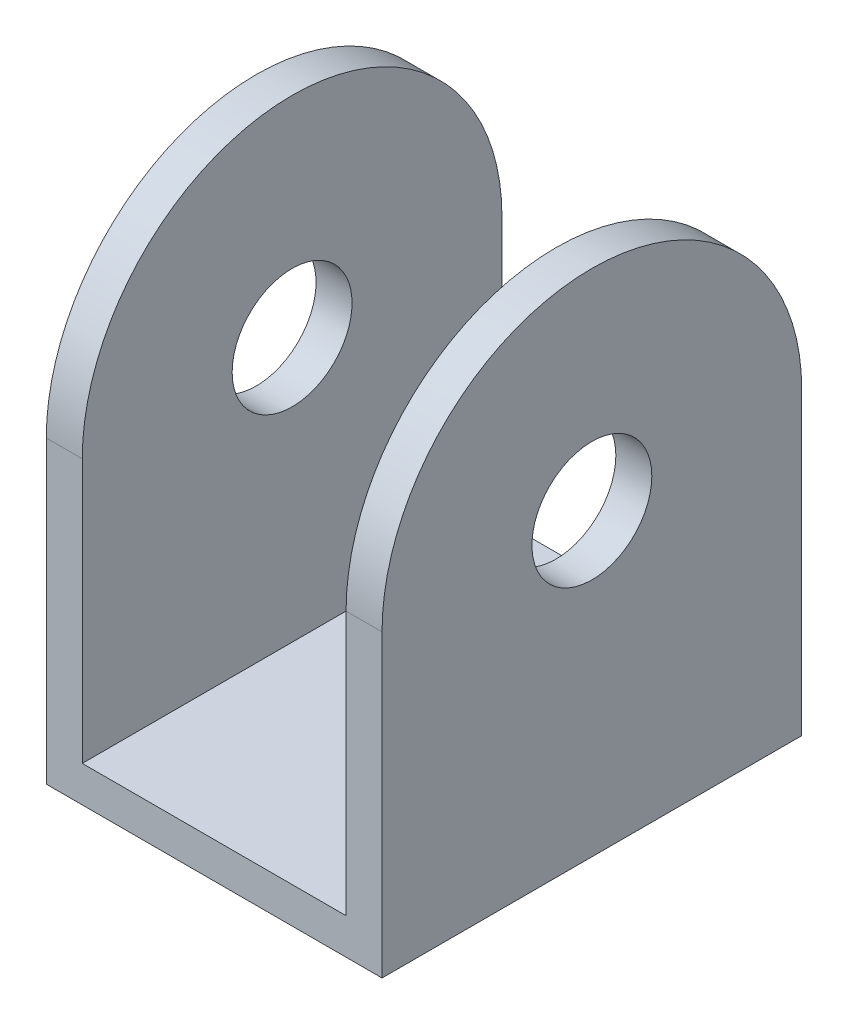
ISO-10303-21;
HEADER;
FILE_DESCRIPTION(('STEP AP214'),'2;1');
FILE_NAME('part.step','',(''),(''),'','','');
FILE_SCHEMA(('AUTOMOTIVE_DESIGN { 1 0 10303 214 1 1 1 1 }'));
ENDSEC;
DATA;
#1=APPLICATION_CONTEXT('core data for automotive mechanical design processes');
#2=APPLICATION_PROTOCOL_DEFINITION('international standard','automotive_design',2000,#1);
#3=PRODUCT_CONTEXT('',#1,'mechanical');
#4=PRODUCT('Part','Part','',(#3));
#5=PRODUCT_RELATED_PRODUCT_CATEGORY('part','',(#4));
#6=PRODUCT_DEFINITION_FORMATION('','',#4);
#7=PRODUCT_DEFINITION_CONTEXT('part definition',#1,'design');
#8=PRODUCT_DEFINITION('design','',#6,#7);
#9=PRODUCT_DEFINITION_SHAPE('','',#8);
#10=(LENGTH_UNIT() NAMED_UNIT(*) SI_UNIT(.MILLI.,.METRE.));
#11=(NAMED_UNIT(*) PLANE_ANGLE_UNIT() SI_UNIT($,.RADIAN.));
#12=(NAMED_UNIT(*) SI_UNIT($,.STERADIAN.) SOLID_ANGLE_UNIT());
#13=UNCERTAINTY_MEASURE_WITH_UNIT(LENGTH_MEASURE(1.E-05),#10,'distance_accuracy_value','');
#14=(GEOMETRIC_REPRESENTATION_CONTEXT(3) GLOBAL_UNCERTAINTY_ASSIGNED_CONTEXT((#13)) GLOBAL_UNIT_ASSIGNED_CONTEXT((#10,
#11,#12)) REPRESENTATION_CONTEXT('',''));
#15=CARTESIAN_POINT('',(0.,0.,0.));
#16=DIRECTION('',(0.,0.,1.));
#17=DIRECTION('',(1.,0.,0.));
#18=AXIS2_PLACEMENT_3D('',#15,#16,#17);
#19=CARTESIAN_POINT('',(-56.1860465116279,3.,17.5813953488372));
#20=DIRECTION('',(0.,0.,-1.));
#21=DIRECTION('',(-1.,0.,0.));
#22=AXIS2_PLACEMENT_3D('',#19,#20,#21);
#23=PLANE('',#22);
#24=DIRECTION('',(1.,0.,0.));
#25=VECTOR('',#24,1.);
#26=CARTESIAN_POINT('',(-56.1860465116279,0.,17.5813953488372));
#27=LINE('',#26,#25);
#28=CARTESIAN_POINT('',(-59.186046511628,0.,17.5813953488372));
#29=VERTEX_POINT('',#28);
#30=CARTESIAN_POINT('',(-31.1860465116279,0.,17.5813953488372));
#31=VERTEX_POINT('',#30);
#32=EDGE_CURVE('E178',#29,#31,#27,.T.);
#33=ORIENTED_EDGE('',*,*,#32,.T.);
#34=DIRECTION('',(0.,1.,0.));
#35=VECTOR('',#34,1.);
#36=CARTESIAN_POINT('',(-31.1860465116279,0.,17.5813953488372));
#37=LINE('',#36,#35);
#38=CARTESIAN_POINT('',(-31.1860465116279,25.,17.5813953488372));
#39=VERTEX_POINT('',#38);
#40=EDGE_CURVE('E153',#31,#39,#37,.T.);
#41=ORIENTED_EDGE('',*,*,#40,.T.);
#42=DIRECTION('',(-1.,0.,0.));
#43=VECTOR('',#42,1.);
#44=CARTESIAN_POINT('',(-31.1860465116279,25.,17.5813953488372));
#45=LINE('',#44,#43);
#46=CARTESIAN_POINT('',(-34.1860465116279,25.,17.5813953488372));
#47=VERTEX_POINT('',#46);
#48=EDGE_CURVE('E175',#39,#47,#45,.T.);
#49=ORIENTED_EDGE('',*,*,#48,.T.);
#50=DIRECTION('',(0.,1.,0.));
#51=VECTOR('',#50,1.);
#52=CARTESIAN_POINT('',(-34.1860465116279,0.,17.5813953488372));
#53=LINE('',#52,#51);
#54=CARTESIAN_POINT('',(-34.1860465116279,3.,17.5813953488372));
#55=VERTEX_POINT('',#54);
#56=EDGE_CURVE('E168',#55,#47,#53,.T.);
#57=ORIENTED_EDGE('',*,*,#56,.F.);
#58=DIRECTION('',(1.,0.,0.));
#59=VECTOR('',#58,1.);
#60=CARTESIAN_POINT('',(-56.1860465116279,3.,17.5813953488372));
#61=LINE('',#60,#59);
#62=CARTESIAN_POINT('',(-56.1860465116279,3.,17.5813953488372));
#63=VERTEX_POINT('',#62);
#64=EDGE_CURVE('E182',#63,#55,#61,.T.);
#65=ORIENTED_EDGE('',*,*,#64,.F.);
#66=DIRECTION('',(0.,1.,0.));
#67=VECTOR('',#66,1.);
#68=CARTESIAN_POINT('',(-56.186046511628,0.,17.5813953488372));
#69=LINE('',#68,#67);
#70=CARTESIAN_POINT('',(-56.186046511628,25.,17.5813953488372));
#71=VERTEX_POINT('',#70);
#72=EDGE_CURVE('E67',#63,#71,#69,.T.);
#73=ORIENTED_EDGE('',*,*,#72,.T.);
#74=DIRECTION('',(1.,0.,0.));
#75=VECTOR('',#74,1.);
#76=CARTESIAN_POINT('',(-59.186046511628,25.,17.5813953488372));
#77=LINE('',#76,#75);
#78=CARTESIAN_POINT('',(-59.186046511628,25.,17.5813953488372));
#79=VERTEX_POINT('',#78);
#80=EDGE_CURVE('E131',#79,#71,#77,.T.);
#81=ORIENTED_EDGE('',*,*,#80,.F.);
#82=DIRECTION('',(0.,1.,0.));
#83=VECTOR('',#82,1.);
#84=CARTESIAN_POINT('',(-59.186046511628,0.,17.5813953488372));
#85=LINE('',#84,#83);
#86=EDGE_CURVE('E117',#29,#79,#85,.T.);
#87=ORIENTED_EDGE('',*,*,#86,.F.);
#88=EDGE_LOOP('',(#33,#41,#49,#57,#65,#73,#81,#87));
#89=FACE_BOUND('',#88,.T.);
#90=ADVANCED_FACE('F43',(#89),#23,.F.);
#91=CARTESIAN_POINT('',(-56.186046511628,3.,-17.4186046511628));
#92=DIRECTION('',(0.,0.,1.));
#93=DIRECTION('',(1.,0.,0.));
#94=AXIS2_PLACEMENT_3D('',#91,#92,#93);
#95=PLANE('',#94);
#96=DIRECTION('',(-1.,0.,0.));
#97=VECTOR('',#96,1.);
#98=CARTESIAN_POINT('',(-56.186046511628,0.,-17.4186046511628));
#99=LINE('',#98,#97);
#100=CARTESIAN_POINT('',(-31.186046511628,0.,-17.4186046511628));
#101=VERTEX_POINT('',#100);
#102=CARTESIAN_POINT('',(-59.186046511628,0.,-17.4186046511628));
#103=VERTEX_POINT('',#102);
#104=EDGE_CURVE('E46',#101,#103,#99,.T.);
#105=ORIENTED_EDGE('',*,*,#104,.T.);
#106=DIRECTION('',(0.,1.,0.));
#107=VECTOR('',#106,1.);
#108=CARTESIAN_POINT('',(-59.186046511628,0.,-17.4186046511628));
#109=LINE('',#108,#107);
#110=CARTESIAN_POINT('',(-59.186046511628,25.,-17.4186046511628));
#111=VERTEX_POINT('',#110);
#112=EDGE_CURVE('E115',#103,#111,#109,.T.);
#113=ORIENTED_EDGE('',*,*,#112,.T.);
#114=DIRECTION('',(1.,0.,0.));
#115=VECTOR('',#114,1.);
#116=CARTESIAN_POINT('',(-59.186046511628,25.,-17.4186046511628));
#117=LINE('',#116,#115);
#118=CARTESIAN_POINT('',(-56.186046511628,25.,-17.4186046511628));
#119=VERTEX_POINT('',#118);
#120=EDGE_CURVE('E125',#111,#119,#117,.T.);
#121=ORIENTED_EDGE('',*,*,#120,.T.);
#122=DIRECTION('',(0.,1.,0.));
#123=VECTOR('',#122,1.);
#124=CARTESIAN_POINT('',(-56.186046511628,0.,-17.4186046511628));
#125=LINE('',#124,#123);
#126=CARTESIAN_POINT('',(-56.186046511628,3.,-17.4186046511628));
#127=VERTEX_POINT('',#126);
#128=EDGE_CURVE('E145',#127,#119,#125,.T.);
#129=ORIENTED_EDGE('',*,*,#128,.F.);
#130=DIRECTION('',(-1.,0.,0.));
#131=VECTOR('',#130,1.);
#132=CARTESIAN_POINT('',(-56.186046511628,3.,-17.4186046511628));
#133=LINE('',#132,#131);
#134=CARTESIAN_POINT('',(-34.186046511628,3.,-17.4186046511628));
#135=VERTEX_POINT('',#134);
#136=EDGE_CURVE('E11',#135,#127,#133,.T.);
#137=ORIENTED_EDGE('',*,*,#136,.F.);
#138=DIRECTION('',(0.,1.,0.));
#139=VECTOR('',#138,1.);
#140=CARTESIAN_POINT('',(-34.186046511628,0.,-17.4186046511628));
#141=LINE('',#140,#139);
#142=CARTESIAN_POINT('',(-34.186046511628,25.,-17.4186046511628));
#143=VERTEX_POINT('',#142);
#144=EDGE_CURVE('E59',#135,#143,#141,.T.);
#145=ORIENTED_EDGE('',*,*,#144,.T.);
#146=DIRECTION('',(-1.,0.,0.));
#147=VECTOR('',#146,1.);
#148=CARTESIAN_POINT('',(-31.186046511628,25.,-17.4186046511628));
#149=LINE('',#148,#147);
#150=CARTESIAN_POINT('',(-31.186046511628,25.,-17.4186046511628));
#151=VERTEX_POINT('',#150);
#152=EDGE_CURVE('E165',#151,#143,#149,.T.);
#153=ORIENTED_EDGE('',*,*,#152,.F.);
#154=DIRECTION('',(0.,1.,0.));
#155=VECTOR('',#154,1.);
#156=CARTESIAN_POINT('',(-31.186046511628,0.,-17.4186046511628));
#157=LINE('',#156,#155);
#158=EDGE_CURVE('E160',#101,#151,#157,.T.);
#159=ORIENTED_EDGE('',*,*,#158,.F.);
#160=EDGE_LOOP('',(#105,#113,#121,#129,#137,#145,#153,#159));
#161=FACE_BOUND('',#160,.T.);
#162=ADVANCED_FACE('F133',(#161),#95,.F.);
#163=CARTESIAN_POINT('',(0.,3.,0.));
#164=DIRECTION('',(0.,1.,0.));
#165=DIRECTION('',(0.,0.,1.));
#166=AXIS2_PLACEMENT_3D('',#163,#164,#165);
#167=PLANE('',#166);
#168=DIRECTION('',(0.,0.,1.));
#169=VECTOR('',#168,1.);
#170=CARTESIAN_POINT('',(-56.186046511628,3.,-17.4186046511628));
#171=LINE('',#170,#169);
#172=EDGE_CURVE('E179',#127,#63,#171,.T.);
#173=ORIENTED_EDGE('',*,*,#172,.T.);
#174=ORIENTED_EDGE('',*,*,#64,.T.);
#175=DIRECTION('',(0.,0.,-1.));
#176=VECTOR('',#175,1.);
#177=CARTESIAN_POINT('',(-34.186046511628,3.,-17.4186046511628));
#178=LINE('',#177,#176);
#179=EDGE_CURVE('E51',#55,#135,#178,.T.);
#180=ORIENTED_EDGE('',*,*,#179,.T.);
#181=ORIENTED_EDGE('',*,*,#136,.T.);
#182=EDGE_LOOP('',(#173,#174,#180,#181));
#183=FACE_BOUND('',#182,.T.);
#184=ADVANCED_FACE('F200',(#183),#167,.T.);
#185=CARTESIAN_POINT('',(0.,0.,0.));
#186=DIRECTION('',(0.,1.,0.));
#187=DIRECTION('',(0.,0.,1.));
#188=AXIS2_PLACEMENT_3D('',#185,#186,#187);
#189=PLANE('',#188);
#190=ORIENTED_EDGE('',*,*,#32,.F.);
#191=DIRECTION('',(0.,0.,1.));
#192=VECTOR('',#191,1.);
#193=CARTESIAN_POINT('',(-59.186046511628,0.,0.));
#194=LINE('',#193,#192);
#195=EDGE_CURVE('E136',#103,#29,#194,.T.);
#196=ORIENTED_EDGE('',*,*,#195,.F.);
#197=ORIENTED_EDGE('',*,*,#104,.F.);
#198=DIRECTION('',(0.,0.,-1.));
#199=VECTOR('',#198,1.);
#200=CARTESIAN_POINT('',(-31.186046511628,0.,0.));
#201=LINE('',#200,#199);
#202=EDGE_CURVE('E157',#31,#101,#201,.T.);
#203=ORIENTED_EDGE('',*,*,#202,.F.);
#204=EDGE_LOOP('',(#190,#196,#197,#203));
#205=FACE_BOUND('',#204,.T.);
#206=ADVANCED_FACE('F189',(#205),#189,.F.);
#207=CARTESIAN_POINT('',(-31.186046511628,25.,0.0813953488372125));
#208=DIRECTION('',(-1.,0.,0.));
#209=DIRECTION('',(0.,0.,1.));
#210=AXIS2_PLACEMENT_3D('',#207,#208,#209);
#211=CYLINDRICAL_SURFACE('',#210,17.5);
#212=CARTESIAN_POINT('',(-34.1860465116279,25.,0.0813953488372137));
#213=DIRECTION('',(1.,0.,0.));
#214=DIRECTION('',(0.,0.,-1.));
#215=AXIS2_PLACEMENT_3D('',#212,#213,#214);
#216=CIRCLE('',#215,17.5);
#217=EDGE_CURVE('E130',#143,#47,#216,.T.);
#218=ORIENTED_EDGE('',*,*,#217,.T.);
#219=ORIENTED_EDGE('',*,*,#48,.F.);
#220=CARTESIAN_POINT('',(-31.186046511628,25.,0.0813953488372125));
#221=DIRECTION('',(1.,0.,0.));
#222=DIRECTION('',(0.,0.,-1.));
#223=AXIS2_PLACEMENT_3D('',#220,#221,#222);
#224=CIRCLE('',#223,17.5);
#225=EDGE_CURVE('E151',#151,#39,#224,.T.);
#226=ORIENTED_EDGE('',*,*,#225,.F.);
#227=ORIENTED_EDGE('',*,*,#152,.T.);
#228=EDGE_LOOP('',(#218,#219,#226,#227));
#229=FACE_BOUND('',#228,.T.);
#230=ADVANCED_FACE('F197',(#229),#211,.T.);
#231=CARTESIAN_POINT('',(-31.186046511628,25.,0.0813953488372125));
#232=DIRECTION('',(-1.,0.,0.));
#233=DIRECTION('',(0.,0.,1.));
#234=AXIS2_PLACEMENT_3D('',#231,#232,#233);
#235=CYLINDRICAL_SURFACE('',#234,5.);
#236=CARTESIAN_POINT('',(-31.186046511628,25.,0.0813953488372125));
#237=DIRECTION('',(1.,0.,0.));
#238=DIRECTION('',(0.,0.,-1.));
#239=AXIS2_PLACEMENT_3D('',#236,#237,#238);
#240=CIRCLE('',#239,5.);
#241=CARTESIAN_POINT('',(-31.186046511628,25.,-4.91860465116279));
#242=VERTEX_POINT('',#241);
#243=EDGE_CURVE('E162',#242,#242,#240,.T.);
#244=ORIENTED_EDGE('',*,*,#243,.T.);
#245=EDGE_LOOP('',(#244));
#246=FACE_BOUND('',#245,.T.);
#247=CARTESIAN_POINT('',(-34.1860465116279,25.,0.0813953488372137));
#248=DIRECTION('',(1.,0.,0.));
#249=DIRECTION('',(0.,0.,-1.));
#250=AXIS2_PLACEMENT_3D('',#247,#248,#249);
#251=CIRCLE('',#250,5.);
#252=CARTESIAN_POINT('',(-34.1860465116279,25.,-4.91860465116279));
#253=VERTEX_POINT('',#252);
#254=EDGE_CURVE('E154',#253,#253,#251,.T.);
#255=ORIENTED_EDGE('',*,*,#254,.F.);
#256=EDGE_LOOP('',(#255));
#257=FACE_BOUND('',#256,.T.);
#258=ADVANCED_FACE('F210',(#246,#257),#235,.F.);
#259=CARTESIAN_POINT('',(-31.186046511628,0.,0.));
#260=DIRECTION('',(1.,0.,0.));
#261=DIRECTION('',(0.,0.,-1.));
#262=AXIS2_PLACEMENT_3D('',#259,#260,#261);
#263=PLANE('',#262);
#264=ORIENTED_EDGE('',*,*,#225,.T.);
#265=ORIENTED_EDGE('',*,*,#40,.F.);
#266=ORIENTED_EDGE('',*,*,#202,.T.);
#267=ORIENTED_EDGE('',*,*,#158,.T.);
#268=EDGE_LOOP('',(#264,#265,#266,#267));
#269=FACE_BOUND('',#268,.T.);
#270=ORIENTED_EDGE('',*,*,#243,.F.);
#271=EDGE_LOOP('',(#270));
#272=FACE_BOUND('',#271,.T.);
#273=ADVANCED_FACE('F191',(#269,#272),#263,.T.);
#274=CARTESIAN_POINT('',(-34.1860465116279,0.,0.));
#275=DIRECTION('',(1.,0.,0.));
#276=DIRECTION('',(0.,0.,-1.));
#277=AXIS2_PLACEMENT_3D('',#274,#275,#276);
#278=PLANE('',#277);
#279=ORIENTED_EDGE('',*,*,#179,.F.);
#280=ORIENTED_EDGE('',*,*,#56,.T.);
#281=ORIENTED_EDGE('',*,*,#217,.F.);
#282=ORIENTED_EDGE('',*,*,#144,.F.);
#283=EDGE_LOOP('',(#279,#280,#281,#282));
#284=FACE_BOUND('',#283,.T.);
#285=ORIENTED_EDGE('',*,*,#254,.T.);
#286=EDGE_LOOP('',(#285));
#287=FACE_BOUND('',#286,.T.);
#288=ADVANCED_FACE('F204',(#284,#287),#278,.F.);
#289=CARTESIAN_POINT('',(-59.186046511628,25.,0.0813953488372119));
#290=DIRECTION('',(1.,0.,0.));
#291=DIRECTION('',(0.,0.,-1.));
#292=AXIS2_PLACEMENT_3D('',#289,#290,#291);
#293=CYLINDRICAL_SURFACE('',#292,17.5);
#294=CARTESIAN_POINT('',(-56.186046511628,25.,0.0813953488372113));
#295=DIRECTION('',(-1.,0.,0.));
#296=DIRECTION('',(0.,0.,1.));
#297=AXIS2_PLACEMENT_3D('',#294,#295,#296);
#298=CIRCLE('',#297,17.5);
#299=EDGE_CURVE('E127',#71,#119,#298,.T.);
#300=ORIENTED_EDGE('',*,*,#299,.T.);
#301=ORIENTED_EDGE('',*,*,#120,.F.);
#302=CARTESIAN_POINT('',(-59.186046511628,25.,0.0813953488372119));
#303=DIRECTION('',(-1.,0.,0.));
#304=DIRECTION('',(0.,0.,1.));
#305=AXIS2_PLACEMENT_3D('',#302,#303,#304);
#306=CIRCLE('',#305,17.5);
#307=EDGE_CURVE('E109',#79,#111,#306,.T.);
#308=ORIENTED_EDGE('',*,*,#307,.F.);
#309=ORIENTED_EDGE('',*,*,#80,.T.);
#310=EDGE_LOOP('',(#300,#301,#308,#309));
#311=FACE_BOUND('',#310,.T.);
#312=ADVANCED_FACE('F126',(#311),#293,.T.);
#313=CARTESIAN_POINT('',(-59.186046511628,25.,0.0813953488372119));
#314=DIRECTION('',(1.,0.,0.));
#315=DIRECTION('',(0.,0.,-1.));
#316=AXIS2_PLACEMENT_3D('',#313,#314,#315);
#317=CYLINDRICAL_SURFACE('',#316,5.);
#318=CARTESIAN_POINT('',(-59.186046511628,25.,0.0813953488372119));
#319=DIRECTION('',(-1.,0.,0.));
#320=DIRECTION('',(0.,0.,1.));
#321=AXIS2_PLACEMENT_3D('',#318,#319,#320);
#322=CIRCLE('',#321,5.);
#323=CARTESIAN_POINT('',(-59.186046511628,25.,5.08139534883721));
#324=VERTEX_POINT('',#323);
#325=EDGE_CURVE('E141',#324,#324,#322,.T.);
#326=ORIENTED_EDGE('',*,*,#325,.T.);
#327=EDGE_LOOP('',(#326));
#328=FACE_BOUND('',#327,.T.);
#329=CARTESIAN_POINT('',(-56.186046511628,25.,0.0813953488372113));
#330=DIRECTION('',(-1.,0.,0.));
#331=DIRECTION('',(0.,0.,1.));
#332=AXIS2_PLACEMENT_3D('',#329,#330,#331);
#333=CIRCLE('',#332,5.);
#334=CARTESIAN_POINT('',(-56.186046511628,25.,5.08139534883721));
#335=VERTEX_POINT('',#334);
#336=EDGE_CURVE('E121',#335,#335,#333,.T.);
#337=ORIENTED_EDGE('',*,*,#336,.F.);
#338=EDGE_LOOP('',(#337));
#339=FACE_BOUND('',#338,.T.);
#340=ADVANCED_FACE('F241',(#328,#339),#317,.F.);
#341=CARTESIAN_POINT('',(-59.186046511628,0.,0.));
#342=DIRECTION('',(-1.,0.,0.));
#343=DIRECTION('',(0.,0.,1.));
#344=AXIS2_PLACEMENT_3D('',#341,#342,#343);
#345=PLANE('',#344);
#346=ORIENTED_EDGE('',*,*,#307,.T.);
#347=ORIENTED_EDGE('',*,*,#112,.F.);
#348=ORIENTED_EDGE('',*,*,#195,.T.);
#349=ORIENTED_EDGE('',*,*,#86,.T.);
#350=EDGE_LOOP('',(#346,#347,#348,#349));
#351=FACE_BOUND('',#350,.T.);
#352=ORIENTED_EDGE('',*,*,#325,.F.);
#353=EDGE_LOOP('',(#352));
#354=FACE_BOUND('',#353,.T.);
#355=ADVANCED_FACE('F111',(#351,#354),#345,.T.);
#356=CARTESIAN_POINT('',(-56.186046511628,0.,0.));
#357=DIRECTION('',(-1.,0.,0.));
#358=DIRECTION('',(0.,0.,1.));
#359=AXIS2_PLACEMENT_3D('',#356,#357,#358);
#360=PLANE('',#359);
#361=ORIENTED_EDGE('',*,*,#172,.F.);
#362=ORIENTED_EDGE('',*,*,#128,.T.);
#363=ORIENTED_EDGE('',*,*,#299,.F.);
#364=ORIENTED_EDGE('',*,*,#72,.F.);
#365=EDGE_LOOP('',(#361,#362,#363,#364));
#366=FACE_BOUND('',#365,.T.);
#367=ORIENTED_EDGE('',*,*,#336,.T.);
#368=EDGE_LOOP('',(#367));
#369=FACE_BOUND('',#368,.T.);
#370=ADVANCED_FACE('F202',(#366,#369),#360,.F.);
#371=CLOSED_SHELL('',(#90,#162,#184,#206,#230,#258,#273,#288,#312,#340,#355,#370));
#372=MANIFOLD_SOLID_BREP('B2',#371);
#373=ADVANCED_BREP_SHAPE_REPRESENTATION('',(#18,#372),#14);
#374=SHAPE_DEFINITION_REPRESENTATION(#9,#373);
ENDSEC;
END-ISO-10303-21;
